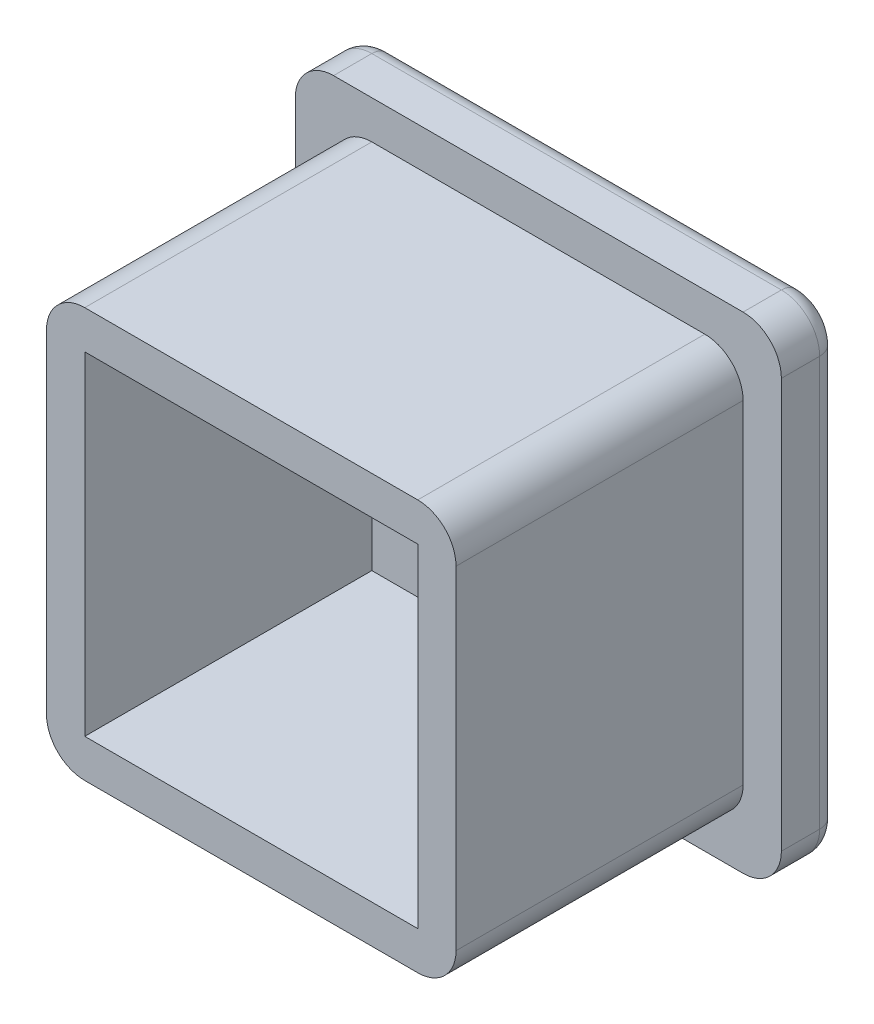
ISO-10303-21;
HEADER;
FILE_DESCRIPTION(('STEP AP214'),'2;1');
FILE_NAME('part.step','',(''),(''),'','','');
FILE_SCHEMA(('AUTOMOTIVE_DESIGN { 1 0 10303 214 1 1 1 1 }'));
ENDSEC;
DATA;
#1=APPLICATION_CONTEXT('core data for automotive mechanical design processes');
#2=APPLICATION_PROTOCOL_DEFINITION('international standard','automotive_design',2000,#1);
#3=PRODUCT_CONTEXT('',#1,'mechanical');
#4=PRODUCT('Part','Part','',(#3));
#5=PRODUCT_RELATED_PRODUCT_CATEGORY('part','',(#4));
#6=PRODUCT_DEFINITION_FORMATION('','',#4);
#7=PRODUCT_DEFINITION_CONTEXT('part definition',#1,'design');
#8=PRODUCT_DEFINITION('design','',#6,#7);
#9=PRODUCT_DEFINITION_SHAPE('','',#8);
#10=(LENGTH_UNIT() NAMED_UNIT(*) SI_UNIT(.MILLI.,.METRE.));
#11=(NAMED_UNIT(*) PLANE_ANGLE_UNIT() SI_UNIT($,.RADIAN.));
#12=(NAMED_UNIT(*) SI_UNIT($,.STERADIAN.) SOLID_ANGLE_UNIT());
#13=UNCERTAINTY_MEASURE_WITH_UNIT(LENGTH_MEASURE(1.E-05),#10,'distance_accuracy_value','');
#14=(GEOMETRIC_REPRESENTATION_CONTEXT(3) GLOBAL_UNCERTAINTY_ASSIGNED_CONTEXT((#13)) GLOBAL_UNIT_ASSIGNED_CONTEXT((#10,
#11,#12)) REPRESENTATION_CONTEXT('',''));
#15=CARTESIAN_POINT('',(0.,0.,0.));
#16=DIRECTION('',(0.,0.,1.));
#17=DIRECTION('',(1.,0.,0.));
#18=AXIS2_PLACEMENT_3D('',#15,#16,#17);
#19=CARTESIAN_POINT('',(-12.7,12.7,18.));
#20=DIRECTION('',(1.,0.,0.));
#21=DIRECTION('',(0.,1.,0.));
#22=AXIS2_PLACEMENT_3D('',#19,#20,#21);
#23=PLANE('',#22);
#24=DIRECTION('',(0.,0.,-1.));
#25=VECTOR('',#24,1.);
#26=CARTESIAN_POINT('',(-12.7,10.7,18.));
#27=LINE('',#26,#25);
#28=CARTESIAN_POINT('',(-12.7,10.7,3.));
#29=VERTEX_POINT('',#28);
#30=CARTESIAN_POINT('',(-12.7,10.7,1.));
#31=VERTEX_POINT('',#30);
#32=EDGE_CURVE('E463',#29,#31,#27,.T.);
#33=ORIENTED_EDGE('',*,*,#32,.T.);
#34=DIRECTION('',(0.,-1.,0.));
#35=VECTOR('',#34,1.);
#36=CARTESIAN_POINT('',(-12.7,-10.7,1.));
#37=LINE('',#36,#35);
#38=CARTESIAN_POINT('',(-12.7,-10.7,1.));
#39=VERTEX_POINT('',#38);
#40=EDGE_CURVE('E517',#31,#39,#37,.T.);
#41=ORIENTED_EDGE('',*,*,#40,.T.);
#42=DIRECTION('',(0.,0.,-1.));
#43=VECTOR('',#42,1.);
#44=CARTESIAN_POINT('',(-12.7,-10.7,18.));
#45=LINE('',#44,#43);
#46=CARTESIAN_POINT('',(-12.7,-10.7,3.));
#47=VERTEX_POINT('',#46);
#48=EDGE_CURVE('E460',#39,#47,#45,.F.);
#49=ORIENTED_EDGE('',*,*,#48,.T.);
#50=DIRECTION('',(0.,-1.,0.));
#51=VECTOR('',#50,1.);
#52=CARTESIAN_POINT('',(-12.7,0.,3.));
#53=LINE('',#52,#51);
#54=EDGE_CURVE('E352',#29,#47,#53,.T.);
#55=ORIENTED_EDGE('',*,*,#54,.F.);
#56=EDGE_LOOP('',(#33,#41,#49,#55));
#57=FACE_BOUND('',#56,.T.);
#58=ADVANCED_FACE('F71',(#57),#23,.F.);
#59=CARTESIAN_POINT('',(12.7,-12.7,18.));
#60=DIRECTION('',(0.,1.,0.));
#61=DIRECTION('',(0.,0.,1.));
#62=AXIS2_PLACEMENT_3D('',#59,#60,#61);
#63=PLANE('',#62);
#64=DIRECTION('',(1.,0.,0.));
#65=VECTOR('',#64,1.);
#66=CARTESIAN_POINT('',(-4.,-12.7,1.5));
#67=LINE('',#66,#65);
#68=CARTESIAN_POINT('',(-4.,-12.7,1.5));
#69=VERTEX_POINT('',#68);
#70=CARTESIAN_POINT('',(4.,-12.7,1.5));
#71=VERTEX_POINT('',#70);
#72=EDGE_CURVE('E285',#69,#71,#67,.T.);
#73=ORIENTED_EDGE('',*,*,#72,.F.);
#74=DIRECTION('',(0.,0.,-1.));
#75=VECTOR('',#74,1.);
#76=CARTESIAN_POINT('',(-4.,-12.7,3.));
#77=LINE('',#76,#75);
#78=CARTESIAN_POINT('',(-4.,-12.7,3.));
#79=VERTEX_POINT('',#78);
#80=EDGE_CURVE('E266',#79,#69,#77,.T.);
#81=ORIENTED_EDGE('',*,*,#80,.F.);
#82=DIRECTION('',(1.,0.,0.));
#83=VECTOR('',#82,1.);
#84=CARTESIAN_POINT('',(0.,-12.7,3.));
#85=LINE('',#84,#83);
#86=CARTESIAN_POINT('',(-10.7,-12.7,3.));
#87=VERTEX_POINT('',#86);
#88=EDGE_CURVE('E358',#87,#79,#85,.T.);
#89=ORIENTED_EDGE('',*,*,#88,.F.);
#90=DIRECTION('',(0.,0.,-1.));
#91=VECTOR('',#90,1.);
#92=CARTESIAN_POINT('',(-10.7,-12.7,18.));
#93=LINE('',#92,#91);
#94=CARTESIAN_POINT('',(-10.7,-12.7,1.));
#95=VERTEX_POINT('',#94);
#96=EDGE_CURVE('E471',#87,#95,#93,.T.);
#97=ORIENTED_EDGE('',*,*,#96,.T.);
#98=DIRECTION('',(1.,0.,0.));
#99=VECTOR('',#98,1.);
#100=CARTESIAN_POINT('',(10.7,-12.7,1.));
#101=LINE('',#100,#99);
#102=CARTESIAN_POINT('',(10.7,-12.7,1.));
#103=VERTEX_POINT('',#102);
#104=EDGE_CURVE('E523',#95,#103,#101,.T.);
#105=ORIENTED_EDGE('',*,*,#104,.T.);
#106=DIRECTION('',(0.,0.,-1.));
#107=VECTOR('',#106,1.);
#108=CARTESIAN_POINT('',(10.7,-12.7,18.));
#109=LINE('',#108,#107);
#110=CARTESIAN_POINT('',(10.7,-12.7,3.));
#111=VERTEX_POINT('',#110);
#112=EDGE_CURVE('E467',#103,#111,#109,.F.);
#113=ORIENTED_EDGE('',*,*,#112,.T.);
#114=CARTESIAN_POINT('',(4.,-12.7,3.));
#115=VERTEX_POINT('',#114);
#116=EDGE_CURVE('E357',#115,#111,#85,.T.);
#117=ORIENTED_EDGE('',*,*,#116,.F.);
#118=DIRECTION('',(0.,0.,1.));
#119=VECTOR('',#118,1.);
#120=CARTESIAN_POINT('',(4.,-12.7,3.));
#121=LINE('',#120,#119);
#122=EDGE_CURVE('E282',#71,#115,#121,.T.);
#123=ORIENTED_EDGE('',*,*,#122,.F.);
#124=EDGE_LOOP('',(#73,#81,#89,#97,#105,#113,#117,#123));
#125=FACE_BOUND('',#124,.T.);
#126=ADVANCED_FACE('F618',(#125),#63,.F.);
#127=CARTESIAN_POINT('',(12.7,12.7,18.));
#128=DIRECTION('',(-1.,0.,0.));
#129=DIRECTION('',(0.,-1.,0.));
#130=AXIS2_PLACEMENT_3D('',#127,#128,#129);
#131=PLANE('',#130);
#132=DIRECTION('',(0.,0.,-1.));
#133=VECTOR('',#132,1.);
#134=CARTESIAN_POINT('',(12.7,-10.7,18.));
#135=LINE('',#134,#133);
#136=CARTESIAN_POINT('',(12.7,-10.7,3.));
#137=VERTEX_POINT('',#136);
#138=CARTESIAN_POINT('',(12.7,-10.7,1.));
#139=VERTEX_POINT('',#138);
#140=EDGE_CURVE('E441',#137,#139,#135,.T.);
#141=ORIENTED_EDGE('',*,*,#140,.T.);
#142=DIRECTION('',(0.,1.,0.));
#143=VECTOR('',#142,1.);
#144=CARTESIAN_POINT('',(12.7,10.7,1.));
#145=LINE('',#144,#143);
#146=CARTESIAN_POINT('',(12.7,10.7,1.));
#147=VERTEX_POINT('',#146);
#148=EDGE_CURVE('E529',#139,#147,#145,.T.);
#149=ORIENTED_EDGE('',*,*,#148,.T.);
#150=DIRECTION('',(0.,0.,-1.));
#151=VECTOR('',#150,1.);
#152=CARTESIAN_POINT('',(12.7,10.7,18.));
#153=LINE('',#152,#151);
#154=CARTESIAN_POINT('',(12.7,10.7,3.));
#155=VERTEX_POINT('',#154);
#156=EDGE_CURVE('E445',#147,#155,#153,.F.);
#157=ORIENTED_EDGE('',*,*,#156,.T.);
#158=DIRECTION('',(0.,1.,0.));
#159=VECTOR('',#158,1.);
#160=CARTESIAN_POINT('',(12.7,0.,3.));
#161=LINE('',#160,#159);
#162=EDGE_CURVE('E362',#137,#155,#161,.T.);
#163=ORIENTED_EDGE('',*,*,#162,.F.);
#164=EDGE_LOOP('',(#141,#149,#157,#163));
#165=FACE_BOUND('',#164,.T.);
#166=ADVANCED_FACE('F579',(#165),#131,.F.);
#167=CARTESIAN_POINT('',(12.7,12.7,18.));
#168=DIRECTION('',(0.,-1.,0.));
#169=DIRECTION('',(1.,0.,0.));
#170=AXIS2_PLACEMENT_3D('',#167,#168,#169);
#171=PLANE('',#170);
#172=DIRECTION('',(0.,0.,-1.));
#173=VECTOR('',#172,1.);
#174=CARTESIAN_POINT('',(10.7,12.7,18.));
#175=LINE('',#174,#173);
#176=CARTESIAN_POINT('',(10.7,12.7,3.));
#177=VERTEX_POINT('',#176);
#178=CARTESIAN_POINT('',(10.7,12.7,1.));
#179=VERTEX_POINT('',#178);
#180=EDGE_CURVE('E438',#177,#179,#175,.T.);
#181=ORIENTED_EDGE('',*,*,#180,.T.);
#182=DIRECTION('',(-1.,0.,0.));
#183=VECTOR('',#182,1.);
#184=CARTESIAN_POINT('',(-10.7,12.7,1.));
#185=LINE('',#184,#183);
#186=CARTESIAN_POINT('',(-10.7,12.7,1.));
#187=VERTEX_POINT('',#186);
#188=EDGE_CURVE('E12',#179,#187,#185,.T.);
#189=ORIENTED_EDGE('',*,*,#188,.T.);
#190=DIRECTION('',(0.,0.,-1.));
#191=VECTOR('',#190,1.);
#192=CARTESIAN_POINT('',(-10.7,12.7,18.));
#193=LINE('',#192,#191);
#194=CARTESIAN_POINT('',(-10.7,12.7,3.));
#195=VERTEX_POINT('',#194);
#196=EDGE_CURVE('E435',#187,#195,#193,.F.);
#197=ORIENTED_EDGE('',*,*,#196,.T.);
#198=DIRECTION('',(-1.,0.,0.));
#199=VECTOR('',#198,1.);
#200=CARTESIAN_POINT('',(0.,12.7,3.));
#201=LINE('',#200,#199);
#202=EDGE_CURVE('E348',#177,#195,#201,.T.);
#203=ORIENTED_EDGE('',*,*,#202,.F.);
#204=EDGE_LOOP('',(#181,#189,#197,#203));
#205=FACE_BOUND('',#204,.T.);
#206=ADVANCED_FACE('F588',(#205),#171,.F.);
#207=CARTESIAN_POINT('',(0.,0.,0.));
#208=DIRECTION('',(0.,0.,-1.));
#209=DIRECTION('',(-1.,0.,0.));
#210=AXIS2_PLACEMENT_3D('',#207,#208,#209);
#211=PLANE('',#210);
#212=DIRECTION('',(0.,-1.,0.));
#213=VECTOR('',#212,1.);
#214=CARTESIAN_POINT('',(-11.7,10.7,0.));
#215=LINE('',#214,#213);
#216=CARTESIAN_POINT('',(-11.7,-10.7,0.));
#217=VERTEX_POINT('',#216);
#218=CARTESIAN_POINT('',(-11.7,10.7,0.));
#219=VERTEX_POINT('',#218);
#220=EDGE_CURVE('E506',#217,#219,#215,.F.);
#221=ORIENTED_EDGE('',*,*,#220,.T.);
#222=CARTESIAN_POINT('',(-10.7,10.7,0.));
#223=DIRECTION('',(0.,0.,-1.));
#224=DIRECTION('',(-1.,0.,0.));
#225=AXIS2_PLACEMENT_3D('',#222,#223,#224);
#226=CIRCLE('',#225,1.);
#227=CARTESIAN_POINT('',(-10.7,11.7,0.));
#228=VERTEX_POINT('',#227);
#229=EDGE_CURVE('E509',#219,#228,#226,.T.);
#230=ORIENTED_EDGE('',*,*,#229,.T.);
#231=DIRECTION('',(-1.,0.,0.));
#232=VECTOR('',#231,1.);
#233=CARTESIAN_POINT('',(10.7,11.7,0.));
#234=LINE('',#233,#232);
#235=CARTESIAN_POINT('',(10.7,11.7,0.));
#236=VERTEX_POINT('',#235);
#237=EDGE_CURVE('E488',#228,#236,#234,.F.);
#238=ORIENTED_EDGE('',*,*,#237,.T.);
#239=CARTESIAN_POINT('',(10.7,10.7,0.));
#240=DIRECTION('',(0.,0.,-1.));
#241=DIRECTION('',(-1.,0.,0.));
#242=AXIS2_PLACEMENT_3D('',#239,#240,#241);
#243=CIRCLE('',#242,1.);
#244=CARTESIAN_POINT('',(11.7,10.7,0.));
#245=VERTEX_POINT('',#244);
#246=EDGE_CURVE('E491',#236,#245,#243,.T.);
#247=ORIENTED_EDGE('',*,*,#246,.T.);
#248=DIRECTION('',(0.,1.,0.));
#249=VECTOR('',#248,1.);
#250=CARTESIAN_POINT('',(11.7,-10.7,0.));
#251=LINE('',#250,#249);
#252=CARTESIAN_POINT('',(11.7,-10.7,0.));
#253=VERTEX_POINT('',#252);
#254=EDGE_CURVE('E494',#245,#253,#251,.F.);
#255=ORIENTED_EDGE('',*,*,#254,.T.);
#256=CARTESIAN_POINT('',(10.7,-10.7,0.));
#257=DIRECTION('',(0.,0.,-1.));
#258=DIRECTION('',(-1.,0.,0.));
#259=AXIS2_PLACEMENT_3D('',#256,#257,#258);
#260=CIRCLE('',#259,1.);
#261=CARTESIAN_POINT('',(10.7,-11.7,0.));
#262=VERTEX_POINT('',#261);
#263=EDGE_CURVE('E497',#253,#262,#260,.T.);
#264=ORIENTED_EDGE('',*,*,#263,.T.);
#265=DIRECTION('',(1.,0.,0.));
#266=VECTOR('',#265,1.);
#267=CARTESIAN_POINT('',(-10.7,-11.7,0.));
#268=LINE('',#267,#266);
#269=CARTESIAN_POINT('',(-10.7,-11.7,0.));
#270=VERTEX_POINT('',#269);
#271=EDGE_CURVE('E500',#262,#270,#268,.F.);
#272=ORIENTED_EDGE('',*,*,#271,.T.);
#273=CARTESIAN_POINT('',(-10.7,-10.7,0.));
#274=DIRECTION('',(0.,0.,-1.));
#275=DIRECTION('',(-1.,0.,0.));
#276=AXIS2_PLACEMENT_3D('',#273,#274,#275);
#277=CIRCLE('',#276,1.);
#278=EDGE_CURVE('E503',#270,#217,#277,.T.);
#279=ORIENTED_EDGE('',*,*,#278,.T.);
#280=EDGE_LOOP('',(#221,#230,#238,#247,#255,#264,#272,#279));
#281=FACE_BOUND('',#280,.T.);
#282=ADVANCED_FACE('F827',(#281),#211,.T.);
#283=CARTESIAN_POINT('',(0.,10.7,3.));
#284=DIRECTION('',(0.,-1.,0.));
#285=DIRECTION('',(0.,0.,-1.));
#286=AXIS2_PLACEMENT_3D('',#283,#284,#285);
#287=PLANE('',#286);
#288=DIRECTION('',(1.,0.,0.));
#289=VECTOR('',#288,1.);
#290=CARTESIAN_POINT('',(0.,10.7,18.));
#291=LINE('',#290,#289);
#292=CARTESIAN_POINT('',(-8.7,10.7,18.));
#293=VERTEX_POINT('',#292);
#294=CARTESIAN_POINT('',(8.7,10.7,18.));
#295=VERTEX_POINT('',#294);
#296=EDGE_CURVE('E338',#293,#295,#291,.T.);
#297=ORIENTED_EDGE('',*,*,#296,.T.);
#298=DIRECTION('',(0.,0.,1.));
#299=VECTOR('',#298,1.);
#300=CARTESIAN_POINT('',(8.7,10.7,3.));
#301=LINE('',#300,#299);
#302=CARTESIAN_POINT('',(8.7,10.7,3.));
#303=VERTEX_POINT('',#302);
#304=EDGE_CURVE('E418',#295,#303,#301,.F.);
#305=ORIENTED_EDGE('',*,*,#304,.T.);
#306=DIRECTION('',(1.,0.,0.));
#307=VECTOR('',#306,1.);
#308=CARTESIAN_POINT('',(0.,10.7,3.));
#309=LINE('',#308,#307);
#310=CARTESIAN_POINT('',(-8.7,10.7,3.));
#311=VERTEX_POINT('',#310);
#312=EDGE_CURVE('E366',#311,#303,#309,.T.);
#313=ORIENTED_EDGE('',*,*,#312,.F.);
#314=DIRECTION('',(0.,0.,1.));
#315=VECTOR('',#314,1.);
#316=CARTESIAN_POINT('',(-8.7,10.7,18.));
#317=LINE('',#316,#315);
#318=EDGE_CURVE('E414',#311,#293,#317,.T.);
#319=ORIENTED_EDGE('',*,*,#318,.T.);
#320=EDGE_LOOP('',(#297,#305,#313,#319));
#321=FACE_BOUND('',#320,.T.);
#322=ADVANCED_FACE('F641',(#321),#287,.F.);
#323=CARTESIAN_POINT('',(-10.7,0.,3.));
#324=DIRECTION('',(-1.,0.,0.));
#325=DIRECTION('',(0.,-1.,0.));
#326=AXIS2_PLACEMENT_3D('',#323,#324,#325);
#327=PLANE('',#326);
#328=DIRECTION('',(0.,-1.,0.));
#329=VECTOR('',#328,1.);
#330=CARTESIAN_POINT('',(-10.7,0.,3.));
#331=LINE('',#330,#329);
#332=CARTESIAN_POINT('',(-10.7,8.7,3.));
#333=VERTEX_POINT('',#332);
#334=CARTESIAN_POINT('',(-10.7,-8.7,3.));
#335=VERTEX_POINT('',#334);
#336=EDGE_CURVE('E377',#333,#335,#331,.T.);
#337=ORIENTED_EDGE('',*,*,#336,.T.);
#338=DIRECTION('',(0.,0.,1.));
#339=VECTOR('',#338,1.);
#340=CARTESIAN_POINT('',(-10.7,-8.7,3.));
#341=LINE('',#340,#339);
#342=CARTESIAN_POINT('',(-10.7,-8.7,18.));
#343=VERTEX_POINT('',#342);
#344=EDGE_CURVE('E431',#335,#343,#341,.T.);
#345=ORIENTED_EDGE('',*,*,#344,.T.);
#346=DIRECTION('',(0.,-1.,0.));
#347=VECTOR('',#346,1.);
#348=CARTESIAN_POINT('',(-10.7,0.,18.));
#349=LINE('',#348,#347);
#350=CARTESIAN_POINT('',(-10.7,8.7,18.));
#351=VERTEX_POINT('',#350);
#352=EDGE_CURVE('E353',#351,#343,#349,.T.);
#353=ORIENTED_EDGE('',*,*,#352,.F.);
#354=DIRECTION('',(0.,0.,1.));
#355=VECTOR('',#354,1.);
#356=CARTESIAN_POINT('',(-10.7,8.7,3.));
#357=LINE('',#356,#355);
#358=EDGE_CURVE('E428',#351,#333,#357,.F.);
#359=ORIENTED_EDGE('',*,*,#358,.T.);
#360=EDGE_LOOP('',(#337,#345,#353,#359));
#361=FACE_BOUND('',#360,.T.);
#362=ADVANCED_FACE('F627',(#361),#327,.T.);
#363=CARTESIAN_POINT('',(0.,-10.7,3.));
#364=DIRECTION('',(0.,-1.,0.));
#365=DIRECTION('',(0.,0.,-1.));
#366=AXIS2_PLACEMENT_3D('',#363,#364,#365);
#367=PLANE('',#366);
#368=DIRECTION('',(1.,0.,0.));
#369=VECTOR('',#368,1.);
#370=CARTESIAN_POINT('',(0.,-10.7,3.));
#371=LINE('',#370,#369);
#372=CARTESIAN_POINT('',(-8.7,-10.7,3.));
#373=VERTEX_POINT('',#372);
#374=CARTESIAN_POINT('',(-4.,-10.7,3.));
#375=VERTEX_POINT('',#374);
#376=EDGE_CURVE('E280',#373,#375,#371,.T.);
#377=ORIENTED_EDGE('',*,*,#376,.T.);
#378=DIRECTION('',(0.,0.,-1.));
#379=VECTOR('',#378,1.);
#380=CARTESIAN_POINT('',(-4.,-10.7,3.));
#381=LINE('',#380,#379);
#382=CARTESIAN_POINT('',(-4.,-10.7,1.5));
#383=VERTEX_POINT('',#382);
#384=EDGE_CURVE('E263',#375,#383,#381,.T.);
#385=ORIENTED_EDGE('',*,*,#384,.T.);
#386=DIRECTION('',(1.,0.,0.));
#387=VECTOR('',#386,1.);
#388=CARTESIAN_POINT('',(-4.,-10.7,1.5));
#389=LINE('',#388,#387);
#390=CARTESIAN_POINT('',(4.,-10.7,1.5));
#391=VERTEX_POINT('',#390);
#392=EDGE_CURVE('E273',#383,#391,#389,.T.);
#393=ORIENTED_EDGE('',*,*,#392,.T.);
#394=DIRECTION('',(0.,0.,1.));
#395=VECTOR('',#394,1.);
#396=CARTESIAN_POINT('',(4.,-10.7,3.));
#397=LINE('',#396,#395);
#398=CARTESIAN_POINT('',(4.,-10.7,3.));
#399=VERTEX_POINT('',#398);
#400=EDGE_CURVE('E89',#391,#399,#397,.T.);
#401=ORIENTED_EDGE('',*,*,#400,.T.);
#402=CARTESIAN_POINT('',(8.70000000000001,-10.7,3.));
#403=VERTEX_POINT('',#402);
#404=EDGE_CURVE('E374',#399,#403,#371,.T.);
#405=ORIENTED_EDGE('',*,*,#404,.T.);
#406=DIRECTION('',(0.,0.,1.));
#407=VECTOR('',#406,1.);
#408=CARTESIAN_POINT('',(8.70000000000001,-10.7,18.));
#409=LINE('',#408,#407);
#410=CARTESIAN_POINT('',(8.70000000000001,-10.7,18.));
#411=VERTEX_POINT('',#410);
#412=EDGE_CURVE('E424',#403,#411,#409,.T.);
#413=ORIENTED_EDGE('',*,*,#412,.T.);
#414=DIRECTION('',(1.,0.,0.));
#415=VECTOR('',#414,1.);
#416=CARTESIAN_POINT('',(0.,-10.7,18.));
#417=LINE('',#416,#415);
#418=CARTESIAN_POINT('',(-8.7,-10.7,18.));
#419=VERTEX_POINT('',#418);
#420=EDGE_CURVE('E389',#419,#411,#417,.T.);
#421=ORIENTED_EDGE('',*,*,#420,.F.);
#422=DIRECTION('',(0.,0.,1.));
#423=VECTOR('',#422,1.);
#424=CARTESIAN_POINT('',(-8.7,-10.7,3.));
#425=LINE('',#424,#423);
#426=EDGE_CURVE('E421',#419,#373,#425,.F.);
#427=ORIENTED_EDGE('',*,*,#426,.T.);
#428=EDGE_LOOP('',(#377,#385,#393,#401,#405,#413,#421,#427));
#429=FACE_BOUND('',#428,.T.);
#430=ADVANCED_FACE('F278',(#429),#367,.T.);
#431=CARTESIAN_POINT('',(10.7,0.,3.));
#432=DIRECTION('',(-1.,0.,0.));
#433=DIRECTION('',(0.,-1.,0.));
#434=AXIS2_PLACEMENT_3D('',#431,#432,#433);
#435=PLANE('',#434);
#436=DIRECTION('',(0.,-1.,0.));
#437=VECTOR('',#436,1.);
#438=CARTESIAN_POINT('',(10.7,0.,3.));
#439=LINE('',#438,#437);
#440=CARTESIAN_POINT('',(10.7,8.7,3.));
#441=VERTEX_POINT('',#440);
#442=CARTESIAN_POINT('',(10.7,-8.7,3.));
#443=VERTEX_POINT('',#442);
#444=EDGE_CURVE('E370',#441,#443,#439,.T.);
#445=ORIENTED_EDGE('',*,*,#444,.F.);
#446=DIRECTION('',(0.,0.,1.));
#447=VECTOR('',#446,1.);
#448=CARTESIAN_POINT('',(10.7,8.7,3.));
#449=LINE('',#448,#447);
#450=CARTESIAN_POINT('',(10.7,8.7,18.));
#451=VERTEX_POINT('',#450);
#452=EDGE_CURVE('E398',#441,#451,#449,.T.);
#453=ORIENTED_EDGE('',*,*,#452,.T.);
#454=DIRECTION('',(0.,-1.,0.));
#455=VECTOR('',#454,1.);
#456=CARTESIAN_POINT('',(10.7,0.,18.));
#457=LINE('',#456,#455);
#458=CARTESIAN_POINT('',(10.7,-8.7,18.));
#459=VERTEX_POINT('',#458);
#460=EDGE_CURVE('E385',#451,#459,#457,.T.);
#461=ORIENTED_EDGE('',*,*,#460,.T.);
#462=DIRECTION('',(0.,0.,1.));
#463=VECTOR('',#462,1.);
#464=CARTESIAN_POINT('',(10.7,-8.7,3.));
#465=LINE('',#464,#463);
#466=EDGE_CURVE('E381',#459,#443,#465,.F.);
#467=ORIENTED_EDGE('',*,*,#466,.T.);
#468=EDGE_LOOP('',(#445,#453,#461,#467));
#469=FACE_BOUND('',#468,.T.);
#470=ADVANCED_FACE('F649',(#469),#435,.F.);
#471=CARTESIAN_POINT('',(0.,0.,3.));
#472=DIRECTION('',(0.,0.,1.));
#473=DIRECTION('',(1.,0.,0.));
#474=AXIS2_PLACEMENT_3D('',#471,#472,#473);
#475=PLANE('',#474);
#476=DIRECTION('',(0.,-1.,0.));
#477=VECTOR('',#476,1.);
#478=CARTESIAN_POINT('',(-4.,-10.7,3.));
#479=LINE('',#478,#477);
#480=EDGE_CURVE('E294',#375,#79,#479,.T.);
#481=ORIENTED_EDGE('',*,*,#480,.F.);
#482=ORIENTED_EDGE('',*,*,#376,.F.);
#483=CARTESIAN_POINT('',(-8.7,-8.7,3.));
#484=DIRECTION('',(0.,0.,1.));
#485=DIRECTION('',(1.,0.,0.));
#486=AXIS2_PLACEMENT_3D('',#483,#484,#485);
#487=CIRCLE('',#486,2.);
#488=EDGE_CURVE('E482',#373,#335,#487,.F.);
#489=ORIENTED_EDGE('',*,*,#488,.T.);
#490=ORIENTED_EDGE('',*,*,#336,.F.);
#491=CARTESIAN_POINT('',(-8.7,8.7,3.));
#492=DIRECTION('',(0.,0.,1.));
#493=DIRECTION('',(1.,0.,0.));
#494=AXIS2_PLACEMENT_3D('',#491,#492,#493);
#495=CIRCLE('',#494,2.);
#496=EDGE_CURVE('E485',#333,#311,#495,.F.);
#497=ORIENTED_EDGE('',*,*,#496,.T.);
#498=ORIENTED_EDGE('',*,*,#312,.T.);
#499=CARTESIAN_POINT('',(8.7,8.7,3.));
#500=DIRECTION('',(0.,0.,1.));
#501=DIRECTION('',(1.,0.,0.));
#502=AXIS2_PLACEMENT_3D('',#499,#500,#501);
#503=CIRCLE('',#502,2.);
#504=EDGE_CURVE('E475',#303,#441,#503,.F.);
#505=ORIENTED_EDGE('',*,*,#504,.T.);
#506=ORIENTED_EDGE('',*,*,#444,.T.);
#507=CARTESIAN_POINT('',(8.70000000000001,-8.7,3.));
#508=DIRECTION('',(0.,0.,1.));
#509=DIRECTION('',(1.,0.,0.));
#510=AXIS2_PLACEMENT_3D('',#507,#508,#509);
#511=CIRCLE('',#510,2.);
#512=EDGE_CURVE('E478',#443,#403,#511,.F.);
#513=ORIENTED_EDGE('',*,*,#512,.T.);
#514=ORIENTED_EDGE('',*,*,#404,.F.);
#515=DIRECTION('',(0.,-1.,0.));
#516=VECTOR('',#515,1.);
#517=CARTESIAN_POINT('',(4.,-10.7,3.));
#518=LINE('',#517,#516);
#519=EDGE_CURVE('E298',#399,#115,#518,.T.);
#520=ORIENTED_EDGE('',*,*,#519,.T.);
#521=ORIENTED_EDGE('',*,*,#116,.T.);
#522=CARTESIAN_POINT('',(10.7,-10.7,3.));
#523=DIRECTION('',(0.,0.,1.));
#524=DIRECTION('',(1.,0.,0.));
#525=AXIS2_PLACEMENT_3D('',#522,#523,#524);
#526=CIRCLE('',#525,2.);
#527=EDGE_CURVE('E448',#111,#137,#526,.T.);
#528=ORIENTED_EDGE('',*,*,#527,.T.);
#529=ORIENTED_EDGE('',*,*,#162,.T.);
#530=CARTESIAN_POINT('',(10.7,10.7,3.));
#531=DIRECTION('',(0.,0.,1.));
#532=DIRECTION('',(1.,0.,0.));
#533=AXIS2_PLACEMENT_3D('',#530,#531,#532);
#534=CIRCLE('',#533,2.);
#535=EDGE_CURVE('E457',#155,#177,#534,.T.);
#536=ORIENTED_EDGE('',*,*,#535,.T.);
#537=ORIENTED_EDGE('',*,*,#202,.T.);
#538=CARTESIAN_POINT('',(-10.7,10.7,3.));
#539=DIRECTION('',(0.,0.,1.));
#540=DIRECTION('',(1.,0.,0.));
#541=AXIS2_PLACEMENT_3D('',#538,#539,#540);
#542=CIRCLE('',#541,2.);
#543=EDGE_CURVE('E454',#195,#29,#542,.T.);
#544=ORIENTED_EDGE('',*,*,#543,.T.);
#545=ORIENTED_EDGE('',*,*,#54,.T.);
#546=CARTESIAN_POINT('',(-10.7,-10.7,3.));
#547=DIRECTION('',(0.,0.,1.));
#548=DIRECTION('',(1.,0.,0.));
#549=AXIS2_PLACEMENT_3D('',#546,#547,#548);
#550=CIRCLE('',#549,2.);
#551=EDGE_CURVE('E451',#47,#87,#550,.T.);
#552=ORIENTED_EDGE('',*,*,#551,.T.);
#553=ORIENTED_EDGE('',*,*,#88,.T.);
#554=EDGE_LOOP('',(#481,#482,#489,#490,#497,#498,#505,#506,#513,#514,#520,#521,#528,#529,#536,
#537,#544,#545,#552,#553));
#555=FACE_BOUND('',#554,.T.);
#556=ADVANCED_FACE('F582',(#555),#475,.T.);
#557=CARTESIAN_POINT('',(0.,0.,18.));
#558=DIRECTION('',(0.,0.,-1.));
#559=DIRECTION('',(-1.,0.,0.));
#560=AXIS2_PLACEMENT_3D('',#557,#558,#559);
#561=PLANE('',#560);
#562=ORIENTED_EDGE('',*,*,#460,.F.);
#563=CARTESIAN_POINT('',(8.7,8.7,18.));
#564=DIRECTION('',(0.,0.,-1.));
#565=DIRECTION('',(-1.,0.,0.));
#566=AXIS2_PLACEMENT_3D('',#563,#564,#565);
#567=CIRCLE('',#566,2.);
#568=EDGE_CURVE('E411',#451,#295,#567,.F.);
#569=ORIENTED_EDGE('',*,*,#568,.T.);
#570=ORIENTED_EDGE('',*,*,#296,.F.);
#571=CARTESIAN_POINT('',(-8.7,8.7,18.));
#572=DIRECTION('',(0.,0.,-1.));
#573=DIRECTION('',(-1.,0.,0.));
#574=AXIS2_PLACEMENT_3D('',#571,#572,#573);
#575=CIRCLE('',#574,2.);
#576=EDGE_CURVE('E402',#293,#351,#575,.F.);
#577=ORIENTED_EDGE('',*,*,#576,.T.);
#578=ORIENTED_EDGE('',*,*,#352,.T.);
#579=CARTESIAN_POINT('',(-8.7,-8.7,18.));
#580=DIRECTION('',(0.,0.,-1.));
#581=DIRECTION('',(-1.,0.,0.));
#582=AXIS2_PLACEMENT_3D('',#579,#580,#581);
#583=CIRCLE('',#582,2.);
#584=EDGE_CURVE('E405',#343,#419,#583,.F.);
#585=ORIENTED_EDGE('',*,*,#584,.T.);
#586=ORIENTED_EDGE('',*,*,#420,.T.);
#587=CARTESIAN_POINT('',(8.70000000000001,-8.7,18.));
#588=DIRECTION('',(0.,0.,-1.));
#589=DIRECTION('',(-1.,0.,0.));
#590=AXIS2_PLACEMENT_3D('',#587,#588,#589);
#591=CIRCLE('',#590,2.);
#592=EDGE_CURVE('E408',#411,#459,#591,.F.);
#593=ORIENTED_EDGE('',*,*,#592,.T.);
#594=EDGE_LOOP('',(#562,#569,#570,#577,#578,#585,#586,#593));
#595=FACE_BOUND('',#594,.T.);
#596=DIRECTION('',(0.,-1.,0.));
#597=VECTOR('',#596,1.);
#598=CARTESIAN_POINT('',(8.7,0.,18.));
#599=LINE('',#598,#597);
#600=CARTESIAN_POINT('',(8.7,8.7,18.));
#601=VERTEX_POINT('',#600);
#602=CARTESIAN_POINT('',(8.70000000000001,-8.7,18.));
#603=VERTEX_POINT('',#602);
#604=EDGE_CURVE('E320',#601,#603,#599,.T.);
#605=ORIENTED_EDGE('',*,*,#604,.T.);
#606=DIRECTION('',(1.,0.,0.));
#607=VECTOR('',#606,1.);
#608=CARTESIAN_POINT('',(0.,-8.7,18.));
#609=LINE('',#608,#607);
#610=CARTESIAN_POINT('',(-8.7,-8.7,18.));
#611=VERTEX_POINT('',#610);
#612=EDGE_CURVE('E308',#611,#603,#609,.T.);
#613=ORIENTED_EDGE('',*,*,#612,.F.);
#614=DIRECTION('',(0.,-1.,0.));
#615=VECTOR('',#614,1.);
#616=CARTESIAN_POINT('',(-8.7,0.,18.));
#617=LINE('',#616,#615);
#618=CARTESIAN_POINT('',(-8.7,8.7,18.));
#619=VERTEX_POINT('',#618);
#620=EDGE_CURVE('E328',#619,#611,#617,.T.);
#621=ORIENTED_EDGE('',*,*,#620,.F.);
#622=DIRECTION('',(1.,0.,0.));
#623=VECTOR('',#622,1.);
#624=CARTESIAN_POINT('',(0.,8.7,18.));
#625=LINE('',#624,#623);
#626=EDGE_CURVE('E324',#619,#601,#625,.T.);
#627=ORIENTED_EDGE('',*,*,#626,.T.);
#628=EDGE_LOOP('',(#605,#613,#621,#627));
#629=FACE_BOUND('',#628,.T.);
#630=ADVANCED_FACE('F631',(#595,#629),#561,.F.);
#631=CARTESIAN_POINT('',(8.7,0.,3.));
#632=DIRECTION('',(-1.,0.,0.));
#633=DIRECTION('',(0.,-1.,0.));
#634=AXIS2_PLACEMENT_3D('',#631,#632,#633);
#635=PLANE('',#634);
#636=ORIENTED_EDGE('',*,*,#604,.F.);
#637=DIRECTION('',(0.,0.,1.));
#638=VECTOR('',#637,1.);
#639=CARTESIAN_POINT('',(8.7,8.7,3.));
#640=LINE('',#639,#638);
#641=CARTESIAN_POINT('',(8.7,8.7,3.));
#642=VERTEX_POINT('',#641);
#643=EDGE_CURVE('E319',#642,#601,#640,.T.);
#644=ORIENTED_EDGE('',*,*,#643,.F.);
#645=DIRECTION('',(0.,-1.,0.));
#646=VECTOR('',#645,1.);
#647=CARTESIAN_POINT('',(8.7,0.,3.));
#648=LINE('',#647,#646);
#649=CARTESIAN_POINT('',(8.70000000000001,-8.7,3.));
#650=VERTEX_POINT('',#649);
#651=EDGE_CURVE('E304',#642,#650,#648,.T.);
#652=ORIENTED_EDGE('',*,*,#651,.T.);
#653=DIRECTION('',(0.,0.,1.));
#654=VECTOR('',#653,1.);
#655=CARTESIAN_POINT('',(8.70000000000001,-8.7,3.));
#656=LINE('',#655,#654);
#657=EDGE_CURVE('E335',#650,#603,#656,.T.);
#658=ORIENTED_EDGE('',*,*,#657,.T.);
#659=EDGE_LOOP('',(#636,#644,#652,#658));
#660=FACE_BOUND('',#659,.T.);
#661=ADVANCED_FACE('F782',(#660),#635,.T.);
#662=CARTESIAN_POINT('',(0.,-8.7,3.));
#663=DIRECTION('',(0.,-1.,0.));
#664=DIRECTION('',(0.,0.,-1.));
#665=AXIS2_PLACEMENT_3D('',#662,#663,#664);
#666=PLANE('',#665);
#667=ORIENTED_EDGE('',*,*,#612,.T.);
#668=ORIENTED_EDGE('',*,*,#657,.F.);
#669=DIRECTION('',(1.,0.,0.));
#670=VECTOR('',#669,1.);
#671=CARTESIAN_POINT('',(0.,-8.7,3.));
#672=LINE('',#671,#670);
#673=CARTESIAN_POINT('',(-8.7,-8.7,3.));
#674=VERTEX_POINT('',#673);
#675=EDGE_CURVE('E315',#674,#650,#672,.T.);
#676=ORIENTED_EDGE('',*,*,#675,.F.);
#677=DIRECTION('',(0.,0.,1.));
#678=VECTOR('',#677,1.);
#679=CARTESIAN_POINT('',(-8.7,-8.7,3.));
#680=LINE('',#679,#678);
#681=EDGE_CURVE('E339',#674,#611,#680,.T.);
#682=ORIENTED_EDGE('',*,*,#681,.T.);
#683=EDGE_LOOP('',(#667,#668,#676,#682));
#684=FACE_BOUND('',#683,.T.);
#685=ADVANCED_FACE('F774',(#684),#666,.F.);
#686=CARTESIAN_POINT('',(-8.7,0.,3.));
#687=DIRECTION('',(-1.,0.,0.));
#688=DIRECTION('',(0.,-1.,0.));
#689=AXIS2_PLACEMENT_3D('',#686,#687,#688);
#690=PLANE('',#689);
#691=ORIENTED_EDGE('',*,*,#620,.T.);
#692=ORIENTED_EDGE('',*,*,#681,.F.);
#693=DIRECTION('',(0.,-1.,0.));
#694=VECTOR('',#693,1.);
#695=CARTESIAN_POINT('',(-8.7,0.,3.));
#696=LINE('',#695,#694);
#697=CARTESIAN_POINT('',(-8.7,8.7,3.));
#698=VERTEX_POINT('',#697);
#699=EDGE_CURVE('E311',#698,#674,#696,.T.);
#700=ORIENTED_EDGE('',*,*,#699,.F.);
#701=DIRECTION('',(0.,0.,1.));
#702=VECTOR('',#701,1.);
#703=CARTESIAN_POINT('',(-8.7,8.7,3.));
#704=LINE('',#703,#702);
#705=EDGE_CURVE('E342',#698,#619,#704,.T.);
#706=ORIENTED_EDGE('',*,*,#705,.T.);
#707=EDGE_LOOP('',(#691,#692,#700,#706));
#708=FACE_BOUND('',#707,.T.);
#709=ADVANCED_FACE('F766',(#708),#690,.F.);
#710=CARTESIAN_POINT('',(0.,8.7,3.));
#711=DIRECTION('',(0.,-1.,0.));
#712=DIRECTION('',(0.,0.,-1.));
#713=AXIS2_PLACEMENT_3D('',#710,#711,#712);
#714=PLANE('',#713);
#715=ORIENTED_EDGE('',*,*,#626,.F.);
#716=ORIENTED_EDGE('',*,*,#705,.F.);
#717=DIRECTION('',(1.,0.,0.));
#718=VECTOR('',#717,1.);
#719=CARTESIAN_POINT('',(0.,8.7,3.));
#720=LINE('',#719,#718);
#721=EDGE_CURVE('E307',#698,#642,#720,.T.);
#722=ORIENTED_EDGE('',*,*,#721,.T.);
#723=ORIENTED_EDGE('',*,*,#643,.T.);
#724=EDGE_LOOP('',(#715,#716,#722,#723));
#725=FACE_BOUND('',#724,.T.);
#726=ADVANCED_FACE('F757',(#725),#714,.T.);
#727=CARTESIAN_POINT('',(0.,0.,3.));
#728=DIRECTION('',(0.,0.,1.));
#729=DIRECTION('',(1.,0.,0.));
#730=AXIS2_PLACEMENT_3D('',#727,#728,#729);
#731=PLANE('',#730);
#732=ORIENTED_EDGE('',*,*,#651,.F.);
#733=ORIENTED_EDGE('',*,*,#721,.F.);
#734=ORIENTED_EDGE('',*,*,#699,.T.);
#735=ORIENTED_EDGE('',*,*,#675,.T.);
#736=EDGE_LOOP('',(#732,#733,#734,#735));
#737=FACE_BOUND('',#736,.T.);
#738=ADVANCED_FACE('F680',(#737),#731,.T.);
#739=CARTESIAN_POINT('',(8.7,8.7,3.));
#740=DIRECTION('',(0.,0.,1.));
#741=DIRECTION('',(1.,0.,0.));
#742=AXIS2_PLACEMENT_3D('',#739,#740,#741);
#743=CYLINDRICAL_SURFACE('',#742,2.);
#744=ORIENTED_EDGE('',*,*,#504,.F.);
#745=ORIENTED_EDGE('',*,*,#304,.F.);
#746=ORIENTED_EDGE('',*,*,#568,.F.);
#747=ORIENTED_EDGE('',*,*,#452,.F.);
#748=EDGE_LOOP('',(#744,#745,#746,#747));
#749=FACE_BOUND('',#748,.T.);
#750=ADVANCED_FACE('F647',(#749),#743,.T.);
#751=CARTESIAN_POINT('',(8.70000000000001,-8.7,3.));
#752=DIRECTION('',(0.,0.,-1.));
#753=DIRECTION('',(-1.,0.,0.));
#754=AXIS2_PLACEMENT_3D('',#751,#752,#753);
#755=CYLINDRICAL_SURFACE('',#754,2.);
#756=ORIENTED_EDGE('',*,*,#512,.F.);
#757=ORIENTED_EDGE('',*,*,#466,.F.);
#758=ORIENTED_EDGE('',*,*,#592,.F.);
#759=ORIENTED_EDGE('',*,*,#412,.F.);
#760=EDGE_LOOP('',(#756,#757,#758,#759));
#761=FACE_BOUND('',#760,.T.);
#762=ADVANCED_FACE('F654',(#761),#755,.T.);
#763=CARTESIAN_POINT('',(-8.7,-8.7,3.));
#764=DIRECTION('',(0.,0.,1.));
#765=DIRECTION('',(1.,0.,0.));
#766=AXIS2_PLACEMENT_3D('',#763,#764,#765);
#767=CYLINDRICAL_SURFACE('',#766,2.);
#768=ORIENTED_EDGE('',*,*,#488,.F.);
#769=ORIENTED_EDGE('',*,*,#426,.F.);
#770=ORIENTED_EDGE('',*,*,#584,.F.);
#771=ORIENTED_EDGE('',*,*,#344,.F.);
#772=EDGE_LOOP('',(#768,#769,#770,#771));
#773=FACE_BOUND('',#772,.T.);
#774=ADVANCED_FACE('F624',(#773),#767,.T.);
#775=CARTESIAN_POINT('',(-8.7,8.7,3.));
#776=DIRECTION('',(0.,0.,-1.));
#777=DIRECTION('',(-1.,0.,0.));
#778=AXIS2_PLACEMENT_3D('',#775,#776,#777);
#779=CYLINDRICAL_SURFACE('',#778,2.);
#780=ORIENTED_EDGE('',*,*,#496,.F.);
#781=ORIENTED_EDGE('',*,*,#358,.F.);
#782=ORIENTED_EDGE('',*,*,#576,.F.);
#783=ORIENTED_EDGE('',*,*,#318,.F.);
#784=EDGE_LOOP('',(#780,#781,#782,#783));
#785=FACE_BOUND('',#784,.T.);
#786=ADVANCED_FACE('F638',(#785),#779,.T.);
#787=CARTESIAN_POINT('',(10.7,10.7,18.));
#788=DIRECTION('',(0.,0.,-1.));
#789=DIRECTION('',(-1.,0.,0.));
#790=AXIS2_PLACEMENT_3D('',#787,#788,#789);
#791=CYLINDRICAL_SURFACE('',#790,2.);
#792=ORIENTED_EDGE('',*,*,#156,.F.);
#793=CARTESIAN_POINT('',(10.7,10.7,1.));
#794=DIRECTION('',(0.,0.,-1.));
#795=DIRECTION('',(-1.,0.,0.));
#796=AXIS2_PLACEMENT_3D('',#793,#794,#795);
#797=CIRCLE('',#796,2.);
#798=EDGE_CURVE('E81',#147,#179,#797,.F.);
#799=ORIENTED_EDGE('',*,*,#798,.T.);
#800=ORIENTED_EDGE('',*,*,#180,.F.);
#801=ORIENTED_EDGE('',*,*,#535,.F.);
#802=EDGE_LOOP('',(#792,#799,#800,#801));
#803=FACE_BOUND('',#802,.T.);
#804=ADVANCED_FACE('F584',(#803),#791,.T.);
#805=CARTESIAN_POINT('',(-10.7,10.7,18.));
#806=DIRECTION('',(0.,0.,-1.));
#807=DIRECTION('',(-1.,0.,0.));
#808=AXIS2_PLACEMENT_3D('',#805,#806,#807);
#809=CYLINDRICAL_SURFACE('',#808,2.);
#810=ORIENTED_EDGE('',*,*,#196,.F.);
#811=CARTESIAN_POINT('',(-10.7,10.7,1.));
#812=DIRECTION('',(0.,0.,-1.));
#813=DIRECTION('',(-1.,0.,0.));
#814=AXIS2_PLACEMENT_3D('',#811,#812,#813);
#815=CIRCLE('',#814,2.);
#816=EDGE_CURVE('E513',#187,#31,#815,.F.);
#817=ORIENTED_EDGE('',*,*,#816,.T.);
#818=ORIENTED_EDGE('',*,*,#32,.F.);
#819=ORIENTED_EDGE('',*,*,#543,.F.);
#820=EDGE_LOOP('',(#810,#817,#818,#819));
#821=FACE_BOUND('',#820,.T.);
#822=ADVANCED_FACE('F606',(#821),#809,.T.);
#823=CARTESIAN_POINT('',(-10.7,-10.7,18.));
#824=DIRECTION('',(0.,0.,-1.));
#825=DIRECTION('',(-1.,0.,0.));
#826=AXIS2_PLACEMENT_3D('',#823,#824,#825);
#827=CYLINDRICAL_SURFACE('',#826,2.);
#828=ORIENTED_EDGE('',*,*,#48,.F.);
#829=CARTESIAN_POINT('',(-10.7,-10.7,1.));
#830=DIRECTION('',(0.,0.,-1.));
#831=DIRECTION('',(-1.,0.,0.));
#832=AXIS2_PLACEMENT_3D('',#829,#830,#831);
#833=CIRCLE('',#832,2.);
#834=EDGE_CURVE('E520',#39,#95,#833,.F.);
#835=ORIENTED_EDGE('',*,*,#834,.T.);
#836=ORIENTED_EDGE('',*,*,#96,.F.);
#837=ORIENTED_EDGE('',*,*,#551,.F.);
#838=EDGE_LOOP('',(#828,#835,#836,#837));
#839=FACE_BOUND('',#838,.T.);
#840=ADVANCED_FACE('F615',(#839),#827,.T.);
#841=CARTESIAN_POINT('',(10.7,-10.7,18.));
#842=DIRECTION('',(0.,0.,-1.));
#843=DIRECTION('',(-1.,0.,0.));
#844=AXIS2_PLACEMENT_3D('',#841,#842,#843);
#845=CYLINDRICAL_SURFACE('',#844,2.);
#846=ORIENTED_EDGE('',*,*,#112,.F.);
#847=CARTESIAN_POINT('',(10.7,-10.7,1.));
#848=DIRECTION('',(0.,0.,-1.));
#849=DIRECTION('',(-1.,0.,0.));
#850=AXIS2_PLACEMENT_3D('',#847,#848,#849);
#851=CIRCLE('',#850,2.);
#852=EDGE_CURVE('E526',#103,#139,#851,.F.);
#853=ORIENTED_EDGE('',*,*,#852,.T.);
#854=ORIENTED_EDGE('',*,*,#140,.F.);
#855=ORIENTED_EDGE('',*,*,#527,.F.);
#856=EDGE_LOOP('',(#846,#853,#854,#855));
#857=FACE_BOUND('',#856,.T.);
#858=ADVANCED_FACE('F575',(#857),#845,.T.);
#859=CARTESIAN_POINT('',(10.7,-10.7,1.));
#860=DIRECTION('',(0.,0.,-1.));
#861=DIRECTION('',(-1.,0.,0.));
#862=AXIS2_PLACEMENT_3D('',#859,#860,#861);
#863=DEGENERATE_TOROIDAL_SURFACE('',#862,1.,1.,.T.);
#864=CARTESIAN_POINT('',(11.7,-10.7,1.));
#865=DIRECTION('',(0.,1.,0.));
#866=DIRECTION('',(0.,0.,1.));
#867=AXIS2_PLACEMENT_3D('',#864,#865,#866);
#868=CIRCLE('',#867,1.);
#869=EDGE_CURVE('E554',#139,#253,#868,.T.);
#870=ORIENTED_EDGE('',*,*,#869,.F.);
#871=ORIENTED_EDGE('',*,*,#852,.F.);
#872=CARTESIAN_POINT('',(10.7,-11.7,1.));
#873=DIRECTION('',(-1.,0.,0.));
#874=DIRECTION('',(0.,0.,1.));
#875=AXIS2_PLACEMENT_3D('',#872,#873,#874);
#876=CIRCLE('',#875,1.);
#877=EDGE_CURVE('E75',#262,#103,#876,.T.);
#878=ORIENTED_EDGE('',*,*,#877,.F.);
#879=ORIENTED_EDGE('',*,*,#263,.F.);
#880=EDGE_LOOP('',(#870,#871,#878,#879));
#881=FACE_BOUND('',#880,.T.);
#882=ADVANCED_FACE('F73',(#881),#863,.T.);
#883=CARTESIAN_POINT('',(12.7,-11.7,1.));
#884=DIRECTION('',(-1.,0.,0.));
#885=DIRECTION('',(0.,0.,1.));
#886=AXIS2_PLACEMENT_3D('',#883,#884,#885);
#887=CYLINDRICAL_SURFACE('',#886,1.);
#888=ORIENTED_EDGE('',*,*,#877,.T.);
#889=ORIENTED_EDGE('',*,*,#104,.F.);
#890=CARTESIAN_POINT('',(-10.7,-11.7,1.));
#891=DIRECTION('',(-1.,0.,0.));
#892=DIRECTION('',(0.,0.,1.));
#893=AXIS2_PLACEMENT_3D('',#890,#891,#892);
#894=CIRCLE('',#893,1.);
#895=EDGE_CURVE('E551',#270,#95,#894,.T.);
#896=ORIENTED_EDGE('',*,*,#895,.F.);
#897=ORIENTED_EDGE('',*,*,#271,.F.);
#898=EDGE_LOOP('',(#888,#889,#896,#897));
#899=FACE_BOUND('',#898,.T.);
#900=ADVANCED_FACE('F567',(#899),#887,.T.);
#901=CARTESIAN_POINT('',(11.7,12.7,1.));
#902=DIRECTION('',(0.,-1.,0.));
#903=DIRECTION('',(1.,0.,0.));
#904=AXIS2_PLACEMENT_3D('',#901,#902,#903);
#905=CYLINDRICAL_SURFACE('',#904,1.);
#906=ORIENTED_EDGE('',*,*,#869,.T.);
#907=ORIENTED_EDGE('',*,*,#254,.F.);
#908=CARTESIAN_POINT('',(11.7,10.7,1.));
#909=DIRECTION('',(0.,1.,0.));
#910=DIRECTION('',(0.,0.,1.));
#911=AXIS2_PLACEMENT_3D('',#908,#909,#910);
#912=CIRCLE('',#911,1.);
#913=EDGE_CURVE('E547',#147,#245,#912,.T.);
#914=ORIENTED_EDGE('',*,*,#913,.F.);
#915=ORIENTED_EDGE('',*,*,#148,.F.);
#916=EDGE_LOOP('',(#906,#907,#914,#915));
#917=FACE_BOUND('',#916,.T.);
#918=ADVANCED_FACE('F708',(#917),#905,.T.);
#919=CARTESIAN_POINT('',(-10.7,-10.7,1.));
#920=DIRECTION('',(0.,0.,-1.));
#921=DIRECTION('',(-1.,0.,0.));
#922=AXIS2_PLACEMENT_3D('',#919,#920,#921);
#923=DEGENERATE_TOROIDAL_SURFACE('',#922,1.,1.,.T.);
#924=ORIENTED_EDGE('',*,*,#895,.T.);
#925=ORIENTED_EDGE('',*,*,#834,.F.);
#926=CARTESIAN_POINT('',(-11.7,-10.7,1.));
#927=DIRECTION('',(0.,1.,0.));
#928=DIRECTION('',(0.,0.,1.));
#929=AXIS2_PLACEMENT_3D('',#926,#927,#928);
#930=CIRCLE('',#929,1.);
#931=EDGE_CURVE('E543',#217,#39,#930,.T.);
#932=ORIENTED_EDGE('',*,*,#931,.F.);
#933=ORIENTED_EDGE('',*,*,#278,.F.);
#934=EDGE_LOOP('',(#924,#925,#932,#933));
#935=FACE_BOUND('',#934,.T.);
#936=ADVANCED_FACE('F705',(#935),#923,.T.);
#937=CARTESIAN_POINT('',(10.7,10.7,1.));
#938=DIRECTION('',(0.,0.,-1.));
#939=DIRECTION('',(-1.,0.,0.));
#940=AXIS2_PLACEMENT_3D('',#937,#938,#939);
#941=DEGENERATE_TOROIDAL_SURFACE('',#940,1.,1.,.T.);
#942=ORIENTED_EDGE('',*,*,#913,.T.);
#943=ORIENTED_EDGE('',*,*,#246,.F.);
#944=CARTESIAN_POINT('',(10.7,11.7,1.));
#945=DIRECTION('',(-1.,0.,0.));
#946=DIRECTION('',(0.,0.,1.));
#947=AXIS2_PLACEMENT_3D('',#944,#945,#946);
#948=CIRCLE('',#947,1.);
#949=EDGE_CURVE('E539',#179,#236,#948,.T.);
#950=ORIENTED_EDGE('',*,*,#949,.F.);
#951=ORIENTED_EDGE('',*,*,#798,.F.);
#952=EDGE_LOOP('',(#942,#943,#950,#951));
#953=FACE_BOUND('',#952,.T.);
#954=ADVANCED_FACE('F593',(#953),#941,.T.);
#955=CARTESIAN_POINT('',(-11.7,12.7,1.));
#956=DIRECTION('',(0.,1.,0.));
#957=DIRECTION('',(-1.,0.,0.));
#958=AXIS2_PLACEMENT_3D('',#955,#956,#957);
#959=CYLINDRICAL_SURFACE('',#958,1.);
#960=ORIENTED_EDGE('',*,*,#931,.T.);
#961=ORIENTED_EDGE('',*,*,#40,.F.);
#962=CARTESIAN_POINT('',(-11.7,10.7,1.));
#963=DIRECTION('',(0.,1.,0.));
#964=DIRECTION('',(0.,0.,1.));
#965=AXIS2_PLACEMENT_3D('',#962,#963,#964);
#966=CIRCLE('',#965,1.);
#967=EDGE_CURVE('E536',#219,#31,#966,.T.);
#968=ORIENTED_EDGE('',*,*,#967,.F.);
#969=ORIENTED_EDGE('',*,*,#220,.F.);
#970=EDGE_LOOP('',(#960,#961,#968,#969));
#971=FACE_BOUND('',#970,.T.);
#972=ADVANCED_FACE('F699',(#971),#959,.T.);
#973=CARTESIAN_POINT('',(12.7,11.7,1.));
#974=DIRECTION('',(1.,0.,0.));
#975=DIRECTION('',(0.,1.,0.));
#976=AXIS2_PLACEMENT_3D('',#973,#974,#975);
#977=CYLINDRICAL_SURFACE('',#976,1.);
#978=ORIENTED_EDGE('',*,*,#949,.T.);
#979=ORIENTED_EDGE('',*,*,#237,.F.);
#980=CARTESIAN_POINT('',(-10.7,11.7,1.));
#981=DIRECTION('',(-1.,0.,0.));
#982=DIRECTION('',(0.,0.,1.));
#983=AXIS2_PLACEMENT_3D('',#980,#981,#982);
#984=CIRCLE('',#983,1.);
#985=EDGE_CURVE('E297',#187,#228,#984,.T.);
#986=ORIENTED_EDGE('',*,*,#985,.F.);
#987=ORIENTED_EDGE('',*,*,#188,.F.);
#988=EDGE_LOOP('',(#978,#979,#986,#987));
#989=FACE_BOUND('',#988,.T.);
#990=ADVANCED_FACE('F597',(#989),#977,.T.);
#991=CARTESIAN_POINT('',(-10.7,10.7,1.));
#992=DIRECTION('',(0.,0.,-1.));
#993=DIRECTION('',(-1.,0.,0.));
#994=AXIS2_PLACEMENT_3D('',#991,#992,#993);
#995=DEGENERATE_TOROIDAL_SURFACE('',#994,1.,1.,.T.);
#996=ORIENTED_EDGE('',*,*,#967,.T.);
#997=ORIENTED_EDGE('',*,*,#816,.F.);
#998=ORIENTED_EDGE('',*,*,#985,.T.);
#999=ORIENTED_EDGE('',*,*,#229,.F.);
#1000=EDGE_LOOP('',(#996,#997,#998,#999));
#1001=FACE_BOUND('',#1000,.T.);
#1002=ADVANCED_FACE('F601',(#1001),#995,.T.);
#1003=CARTESIAN_POINT('',(-4.,-10.7,3.));
#1004=DIRECTION('',(-1.,0.,0.));
#1005=DIRECTION('',(0.,0.,1.));
#1006=AXIS2_PLACEMENT_3D('',#1003,#1004,#1005);
#1007=PLANE('',#1006);
#1008=ORIENTED_EDGE('',*,*,#80,.T.);
#1009=DIRECTION('',(0.,-1.,0.));
#1010=VECTOR('',#1009,1.);
#1011=CARTESIAN_POINT('',(-4.,-10.7,1.5));
#1012=LINE('',#1011,#1010);
#1013=EDGE_CURVE('E259',#383,#69,#1012,.T.);
#1014=ORIENTED_EDGE('',*,*,#1013,.F.);
#1015=ORIENTED_EDGE('',*,*,#384,.F.);
#1016=ORIENTED_EDGE('',*,*,#480,.T.);
#1017=EDGE_LOOP('',(#1008,#1014,#1015,#1016));
#1018=FACE_BOUND('',#1017,.T.);
#1019=ADVANCED_FACE('F261',(#1018),#1007,.F.);
#1020=CARTESIAN_POINT('',(4.,-10.7,3.));
#1021=DIRECTION('',(1.,0.,0.));
#1022=DIRECTION('',(0.,0.,-1.));
#1023=AXIS2_PLACEMENT_3D('',#1020,#1021,#1022);
#1024=PLANE('',#1023);
#1025=ORIENTED_EDGE('',*,*,#122,.T.);
#1026=ORIENTED_EDGE('',*,*,#519,.F.);
#1027=ORIENTED_EDGE('',*,*,#400,.F.);
#1028=DIRECTION('',(0.,-1.,0.));
#1029=VECTOR('',#1028,1.);
#1030=CARTESIAN_POINT('',(4.,-10.7,1.5));
#1031=LINE('',#1030,#1029);
#1032=EDGE_CURVE('E271',#391,#71,#1031,.T.);
#1033=ORIENTED_EDGE('',*,*,#1032,.T.);
#1034=EDGE_LOOP('',(#1025,#1026,#1027,#1033));
#1035=FACE_BOUND('',#1034,.T.);
#1036=ADVANCED_FACE('F661',(#1035),#1024,.F.);
#1037=CARTESIAN_POINT('',(-4.,-10.7,1.5));
#1038=DIRECTION('',(0.,0.,-1.));
#1039=DIRECTION('',(-1.,0.,0.));
#1040=AXIS2_PLACEMENT_3D('',#1037,#1038,#1039);
#1041=PLANE('',#1040);
#1042=ORIENTED_EDGE('',*,*,#72,.T.);
#1043=ORIENTED_EDGE('',*,*,#1032,.F.);
#1044=ORIENTED_EDGE('',*,*,#392,.F.);
#1045=ORIENTED_EDGE('',*,*,#1013,.T.);
#1046=EDGE_LOOP('',(#1042,#1043,#1044,#1045));
#1047=FACE_BOUND('',#1046,.T.);
#1048=ADVANCED_FACE('F274',(#1047),#1041,.F.);
#1049=CLOSED_SHELL('',(#58,#126,#166,#206,#282,#322,#362,#430,#470,#556,#630,#661,#685,#709,
#726,#738,#750,#762,#774,#786,#804,#822,#840,#858,#882,#900,#918,#936,#954,#972,#990,#1002,
#1019,#1036,#1048));
#1050=MANIFOLD_SOLID_BREP('B2',#1049);
#1051=ADVANCED_BREP_SHAPE_REPRESENTATION('',(#18,#1050),#14);
#1052=SHAPE_DEFINITION_REPRESENTATION(#9,#1051);
ENDSEC;
END-ISO-10303-21;
